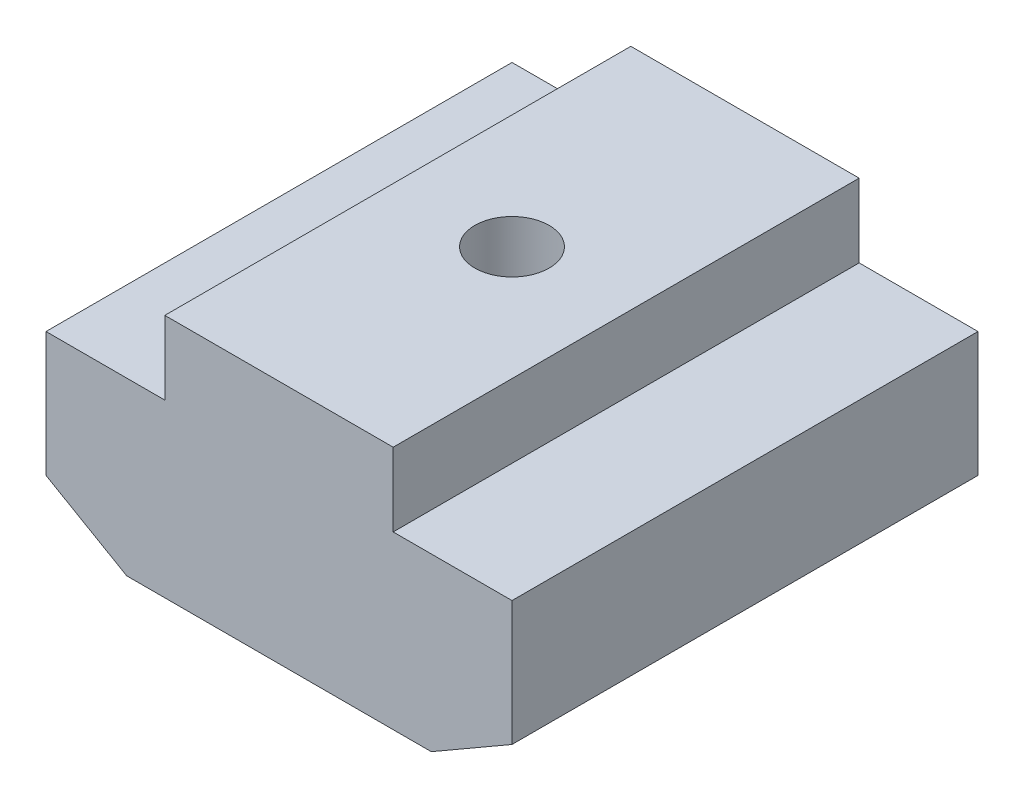
ISO-10303-21;
HEADER;
FILE_DESCRIPTION(('STEP AP214'),'2;1');
FILE_NAME('part.step','',(''),(''),'','','');
FILE_SCHEMA(('AUTOMOTIVE_DESIGN { 1 0 10303 214 1 1 1 1 }'));
ENDSEC;
DATA;
#1=APPLICATION_CONTEXT('core data for automotive mechanical design processes');
#2=APPLICATION_PROTOCOL_DEFINITION('international standard','automotive_design',2000,#1);
#3=PRODUCT_CONTEXT('',#1,'mechanical');
#4=PRODUCT('Part','Part','',(#3));
#5=PRODUCT_RELATED_PRODUCT_CATEGORY('part','',(#4));
#6=PRODUCT_DEFINITION_FORMATION('','',#4);
#7=PRODUCT_DEFINITION_CONTEXT('part definition',#1,'design');
#8=PRODUCT_DEFINITION('design','',#6,#7);
#9=PRODUCT_DEFINITION_SHAPE('','',#8);
#10=(LENGTH_UNIT() NAMED_UNIT(*) SI_UNIT(.MILLI.,.METRE.));
#11=(NAMED_UNIT(*) PLANE_ANGLE_UNIT() SI_UNIT($,.RADIAN.));
#12=(NAMED_UNIT(*) SI_UNIT($,.STERADIAN.) SOLID_ANGLE_UNIT());
#13=UNCERTAINTY_MEASURE_WITH_UNIT(LENGTH_MEASURE(1.E-05),#10,'distance_accuracy_value','');
#14=(GEOMETRIC_REPRESENTATION_CONTEXT(3) GLOBAL_UNCERTAINTY_ASSIGNED_CONTEXT((#13)) GLOBAL_UNIT_ASSIGNED_CONTEXT((#10,
#11,#12)) REPRESENTATION_CONTEXT('',''));
#15=CARTESIAN_POINT('',(0.,0.,0.));
#16=DIRECTION('',(0.,0.,1.));
#17=DIRECTION('',(1.,0.,0.));
#18=AXIS2_PLACEMENT_3D('',#15,#16,#17);
#19=CARTESIAN_POINT('',(-10.,-1.675,0.));
#20=DIRECTION('',(0.50000000000019,0.866025403784329,0.));
#21=DIRECTION('',(0.,0.,-1.));
#22=AXIS2_PLACEMENT_3D('',#19,#20,#21);
#23=PLANE('',#22);
#24=DIRECTION('',(0.,0.,1.));
#25=VECTOR('',#24,1.);
#26=CARTESIAN_POINT('',(-10.,-1.675,0.));
#27=LINE('',#26,#25);
#28=CARTESIAN_POINT('',(-10.,-1.675,-10.));
#29=VERTEX_POINT('',#28);
#30=CARTESIAN_POINT('',(-10.,-1.675,10.));
#31=VERTEX_POINT('',#30);
#32=EDGE_CURVE('E238',#29,#31,#27,.T.);
#33=ORIENTED_EDGE('',*,*,#32,.F.);
#34=DIRECTION('',(0.866025403784329,-0.50000000000019,0.));
#35=VECTOR('',#34,1.);
#36=CARTESIAN_POINT('',(-8.26794919243,-2.675,-10.));
#37=LINE('',#36,#35);
#38=CARTESIAN_POINT('',(-6.53589838486,-3.675,-10.));
#39=VERTEX_POINT('',#38);
#40=EDGE_CURVE('E250',#29,#39,#37,.T.);
#41=ORIENTED_EDGE('',*,*,#40,.T.);
#42=DIRECTION('',(0.,0.,1.));
#43=VECTOR('',#42,1.);
#44=CARTESIAN_POINT('',(-6.53589838486,-3.675,0.));
#45=LINE('',#44,#43);
#46=CARTESIAN_POINT('',(-6.53589838486,-3.675,10.));
#47=VERTEX_POINT('',#46);
#48=EDGE_CURVE('E11',#39,#47,#45,.T.);
#49=ORIENTED_EDGE('',*,*,#48,.T.);
#50=DIRECTION('',(-0.866025403784329,0.50000000000019,0.));
#51=VECTOR('',#50,1.);
#52=CARTESIAN_POINT('',(-8.26794919243,-2.675,10.));
#53=LINE('',#52,#51);
#54=EDGE_CURVE('E20',#47,#31,#53,.T.);
#55=ORIENTED_EDGE('',*,*,#54,.T.);
#56=EDGE_LOOP('',(#33,#41,#49,#55));
#57=FACE_BOUND('',#56,.T.);
#58=ADVANCED_FACE('F17',(#57),#23,.F.);
#59=CARTESIAN_POINT('',(10.,-3.675,0.));
#60=DIRECTION('',(0.,1.,0.));
#61=DIRECTION('',(1.,0.,0.));
#62=AXIS2_PLACEMENT_3D('',#59,#60,#61);
#63=PLANE('',#62);
#64=CARTESIAN_POINT('',(0.,-3.675,0.));
#65=DIRECTION('',(0.,1.,0.));
#66=DIRECTION('',(1.,0.,0.));
#67=AXIS2_PLACEMENT_3D('',#64,#65,#66);
#68=CIRCLE('',#67,2.4585);
#69=CARTESIAN_POINT('',(-2.4585,-3.675,0.));
#70=VERTEX_POINT('',#69);
#71=CARTESIAN_POINT('',(2.4585,-3.675,0.));
#72=VERTEX_POINT('',#71);
#73=EDGE_CURVE('E299',#70,#72,#68,.T.);
#74=ORIENTED_EDGE('',*,*,#73,.T.);
#75=CARTESIAN_POINT('',(0.,-3.675,0.));
#76=DIRECTION('',(0.,1.,0.));
#77=DIRECTION('',(1.,0.,0.));
#78=AXIS2_PLACEMENT_3D('',#75,#76,#77);
#79=CIRCLE('',#78,2.4585);
#80=EDGE_CURVE('E273',#72,#70,#79,.T.);
#81=ORIENTED_EDGE('',*,*,#80,.T.);
#82=EDGE_LOOP('',(#74,#81));
#83=FACE_BOUND('',#82,.T.);
#84=ORIENTED_EDGE('',*,*,#48,.F.);
#85=DIRECTION('',(1.,0.,0.));
#86=VECTOR('',#85,1.);
#87=CARTESIAN_POINT('',(0.,-3.675,-10.));
#88=LINE('',#87,#86);
#89=CARTESIAN_POINT('',(6.53589838486,-3.675,-10.));
#90=VERTEX_POINT('',#89);
#91=EDGE_CURVE('E252',#39,#90,#88,.T.);
#92=ORIENTED_EDGE('',*,*,#91,.T.);
#93=DIRECTION('',(0.,0.,1.));
#94=VECTOR('',#93,1.);
#95=CARTESIAN_POINT('',(6.53589838486,-3.675,0.));
#96=LINE('',#95,#94);
#97=CARTESIAN_POINT('',(6.53589838486,-3.675,10.));
#98=VERTEX_POINT('',#97);
#99=EDGE_CURVE('E155',#90,#98,#96,.T.);
#100=ORIENTED_EDGE('',*,*,#99,.T.);
#101=DIRECTION('',(1.,0.,0.));
#102=VECTOR('',#101,1.);
#103=CARTESIAN_POINT('',(0.,-3.675,10.));
#104=LINE('',#103,#102);
#105=EDGE_CURVE('E254',#47,#98,#104,.T.);
#106=ORIENTED_EDGE('',*,*,#105,.F.);
#107=EDGE_LOOP('',(#84,#92,#100,#106));
#108=FACE_BOUND('',#107,.T.);
#109=ADVANCED_FACE('F332',(#83,#108),#63,.F.);
#110=CARTESIAN_POINT('',(0.,0.,10.));
#111=DIRECTION('',(0.,0.,1.));
#112=DIRECTION('',(1.,0.,0.));
#113=AXIS2_PLACEMENT_3D('',#110,#111,#112);
#114=PLANE('',#113);
#115=ORIENTED_EDGE('',*,*,#105,.T.);
#116=DIRECTION('',(-0.866025403784329,-0.50000000000019,0.));
#117=VECTOR('',#116,1.);
#118=CARTESIAN_POINT('',(8.26794919243,-2.675,10.));
#119=LINE('',#118,#117);
#120=CARTESIAN_POINT('',(10.,-1.675,10.));
#121=VERTEX_POINT('',#120);
#122=EDGE_CURVE('E149',#121,#98,#119,.T.);
#123=ORIENTED_EDGE('',*,*,#122,.F.);
#124=DIRECTION('',(0.,1.,0.));
#125=VECTOR('',#124,1.);
#126=CARTESIAN_POINT('',(10.,1.,10.));
#127=LINE('',#126,#125);
#128=CARTESIAN_POINT('',(10.,3.675,10.));
#129=VERTEX_POINT('',#128);
#130=EDGE_CURVE('E142',#121,#129,#127,.T.);
#131=ORIENTED_EDGE('',*,*,#130,.T.);
#132=DIRECTION('',(-1.,0.,0.));
#133=VECTOR('',#132,1.);
#134=CARTESIAN_POINT('',(7.45,3.675,10.));
#135=LINE('',#134,#133);
#136=CARTESIAN_POINT('',(4.9,3.675,10.));
#137=VERTEX_POINT('',#136);
#138=EDGE_CURVE('E146',#129,#137,#135,.T.);
#139=ORIENTED_EDGE('',*,*,#138,.T.);
#140=DIRECTION('',(0.,1.,0.));
#141=VECTOR('',#140,1.);
#142=CARTESIAN_POINT('',(4.9,5.25,10.));
#143=LINE('',#142,#141);
#144=CARTESIAN_POINT('',(4.9,6.825,10.));
#145=VERTEX_POINT('',#144);
#146=EDGE_CURVE('E221',#137,#145,#143,.T.);
#147=ORIENTED_EDGE('',*,*,#146,.T.);
#148=DIRECTION('',(-1.,0.,0.));
#149=VECTOR('',#148,1.);
#150=CARTESIAN_POINT('',(0.,6.825,10.));
#151=LINE('',#150,#149);
#152=CARTESIAN_POINT('',(-4.9,6.825,10.));
#153=VERTEX_POINT('',#152);
#154=EDGE_CURVE('E206',#145,#153,#151,.T.);
#155=ORIENTED_EDGE('',*,*,#154,.T.);
#156=DIRECTION('',(0.,-1.,0.));
#157=VECTOR('',#156,1.);
#158=CARTESIAN_POINT('',(-4.9,5.25,10.));
#159=LINE('',#158,#157);
#160=CARTESIAN_POINT('',(-4.9,3.675,10.));
#161=VERTEX_POINT('',#160);
#162=EDGE_CURVE('E205',#153,#161,#159,.T.);
#163=ORIENTED_EDGE('',*,*,#162,.T.);
#164=DIRECTION('',(-1.,0.,0.));
#165=VECTOR('',#164,1.);
#166=CARTESIAN_POINT('',(-7.45,3.675,10.));
#167=LINE('',#166,#165);
#168=CARTESIAN_POINT('',(-10.,3.675,10.));
#169=VERTEX_POINT('',#168);
#170=EDGE_CURVE('E194',#161,#169,#167,.T.);
#171=ORIENTED_EDGE('',*,*,#170,.T.);
#172=DIRECTION('',(0.,-1.,0.));
#173=VECTOR('',#172,1.);
#174=CARTESIAN_POINT('',(-10.,1.,10.));
#175=LINE('',#174,#173);
#176=EDGE_CURVE('E242',#169,#31,#175,.T.);
#177=ORIENTED_EDGE('',*,*,#176,.T.);
#178=ORIENTED_EDGE('',*,*,#54,.F.);
#179=EDGE_LOOP('',(#115,#123,#131,#139,#147,#155,#163,#171,#177,#178));
#180=FACE_BOUND('',#179,.T.);
#181=ADVANCED_FACE('F144',(#180),#114,.T.);
#182=CARTESIAN_POINT('',(0.,0.,-10.));
#183=DIRECTION('',(0.,0.,1.));
#184=DIRECTION('',(1.,0.,0.));
#185=AXIS2_PLACEMENT_3D('',#182,#183,#184);
#186=PLANE('',#185);
#187=ORIENTED_EDGE('',*,*,#40,.F.);
#188=DIRECTION('',(0.,-1.,0.));
#189=VECTOR('',#188,1.);
#190=CARTESIAN_POINT('',(-10.,1.,-10.));
#191=LINE('',#190,#189);
#192=CARTESIAN_POINT('',(-10.,3.675,-10.));
#193=VERTEX_POINT('',#192);
#194=EDGE_CURVE('E246',#193,#29,#191,.T.);
#195=ORIENTED_EDGE('',*,*,#194,.F.);
#196=DIRECTION('',(-1.,0.,0.));
#197=VECTOR('',#196,1.);
#198=CARTESIAN_POINT('',(-7.45,3.675,-10.));
#199=LINE('',#198,#197);
#200=CARTESIAN_POINT('',(-4.9,3.675,-10.));
#201=VERTEX_POINT('',#200);
#202=EDGE_CURVE('E186',#201,#193,#199,.T.);
#203=ORIENTED_EDGE('',*,*,#202,.F.);
#204=DIRECTION('',(0.,-1.,0.));
#205=VECTOR('',#204,1.);
#206=CARTESIAN_POINT('',(-4.9,5.25,-10.));
#207=LINE('',#206,#205);
#208=CARTESIAN_POINT('',(-4.9,6.825,-10.));
#209=VERTEX_POINT('',#208);
#210=EDGE_CURVE('E202',#209,#201,#207,.T.);
#211=ORIENTED_EDGE('',*,*,#210,.F.);
#212=DIRECTION('',(-1.,0.,0.));
#213=VECTOR('',#212,1.);
#214=CARTESIAN_POINT('',(0.,6.825,-10.));
#215=LINE('',#214,#213);
#216=CARTESIAN_POINT('',(4.9,6.825,-10.));
#217=VERTEX_POINT('',#216);
#218=EDGE_CURVE('E210',#217,#209,#215,.T.);
#219=ORIENTED_EDGE('',*,*,#218,.F.);
#220=DIRECTION('',(0.,1.,0.));
#221=VECTOR('',#220,1.);
#222=CARTESIAN_POINT('',(4.9,5.25,-10.));
#223=LINE('',#222,#221);
#224=CARTESIAN_POINT('',(4.9,3.675,-10.));
#225=VERTEX_POINT('',#224);
#226=EDGE_CURVE('E213',#225,#217,#223,.T.);
#227=ORIENTED_EDGE('',*,*,#226,.F.);
#228=DIRECTION('',(-1.,0.,0.));
#229=VECTOR('',#228,1.);
#230=CARTESIAN_POINT('',(7.45,3.675,-10.));
#231=LINE('',#230,#229);
#232=CARTESIAN_POINT('',(10.,3.675,-10.));
#233=VERTEX_POINT('',#232);
#234=EDGE_CURVE('E172',#233,#225,#231,.T.);
#235=ORIENTED_EDGE('',*,*,#234,.F.);
#236=DIRECTION('',(0.,1.,0.));
#237=VECTOR('',#236,1.);
#238=CARTESIAN_POINT('',(10.,1.,-10.));
#239=LINE('',#238,#237);
#240=CARTESIAN_POINT('',(10.,-1.675,-10.));
#241=VERTEX_POINT('',#240);
#242=EDGE_CURVE('E156',#241,#233,#239,.T.);
#243=ORIENTED_EDGE('',*,*,#242,.F.);
#244=DIRECTION('',(0.866025403784329,0.50000000000019,0.));
#245=VECTOR('',#244,1.);
#246=CARTESIAN_POINT('',(8.26794919243,-2.675,-10.));
#247=LINE('',#246,#245);
#248=EDGE_CURVE('E233',#90,#241,#247,.T.);
#249=ORIENTED_EDGE('',*,*,#248,.F.);
#250=ORIENTED_EDGE('',*,*,#91,.F.);
#251=EDGE_LOOP('',(#187,#195,#203,#211,#219,#227,#235,#243,#249,#250));
#252=FACE_BOUND('',#251,.T.);
#253=ADVANCED_FACE('F343',(#252),#186,.F.);
#254=CARTESIAN_POINT('',(-10.,-3.675,0.));
#255=DIRECTION('',(1.,0.,0.));
#256=DIRECTION('',(0.,1.,0.));
#257=AXIS2_PLACEMENT_3D('',#254,#255,#256);
#258=PLANE('',#257);
#259=ORIENTED_EDGE('',*,*,#32,.T.);
#260=ORIENTED_EDGE('',*,*,#176,.F.);
#261=DIRECTION('',(0.,0.,1.));
#262=VECTOR('',#261,1.);
#263=CARTESIAN_POINT('',(-10.,3.675,0.));
#264=LINE('',#263,#262);
#265=EDGE_CURVE('E190',#193,#169,#264,.T.);
#266=ORIENTED_EDGE('',*,*,#265,.F.);
#267=ORIENTED_EDGE('',*,*,#194,.T.);
#268=EDGE_LOOP('',(#259,#260,#266,#267));
#269=FACE_BOUND('',#268,.T.);
#270=ADVANCED_FACE('F339',(#269),#258,.F.);
#271=CARTESIAN_POINT('',(10.,-1.675,0.));
#272=DIRECTION('',(-0.50000000000019,0.866025403784329,0.));
#273=DIRECTION('',(0.,0.,1.));
#274=AXIS2_PLACEMENT_3D('',#271,#272,#273);
#275=PLANE('',#274);
#276=ORIENTED_EDGE('',*,*,#99,.F.);
#277=ORIENTED_EDGE('',*,*,#248,.T.);
#278=DIRECTION('',(0.,0.,1.));
#279=VECTOR('',#278,1.);
#280=CARTESIAN_POINT('',(10.,-1.675,0.));
#281=LINE('',#280,#279);
#282=EDGE_CURVE('E209',#241,#121,#281,.T.);
#283=ORIENTED_EDGE('',*,*,#282,.T.);
#284=ORIENTED_EDGE('',*,*,#122,.T.);
#285=EDGE_LOOP('',(#276,#277,#283,#284));
#286=FACE_BOUND('',#285,.T.);
#287=ADVANCED_FACE('F348',(#286),#275,.F.);
#288=CARTESIAN_POINT('',(10.,3.675,0.));
#289=DIRECTION('',(-1.,0.,0.));
#290=DIRECTION('',(0.,0.,1.));
#291=AXIS2_PLACEMENT_3D('',#288,#289,#290);
#292=PLANE('',#291);
#293=ORIENTED_EDGE('',*,*,#282,.F.);
#294=ORIENTED_EDGE('',*,*,#242,.T.);
#295=DIRECTION('',(0.,0.,1.));
#296=VECTOR('',#295,1.);
#297=CARTESIAN_POINT('',(10.,3.675,0.));
#298=LINE('',#297,#296);
#299=EDGE_CURVE('E162',#233,#129,#298,.T.);
#300=ORIENTED_EDGE('',*,*,#299,.T.);
#301=ORIENTED_EDGE('',*,*,#130,.F.);
#302=EDGE_LOOP('',(#293,#294,#300,#301));
#303=FACE_BOUND('',#302,.T.);
#304=ADVANCED_FACE('F168',(#303),#292,.F.);
#305=CARTESIAN_POINT('',(-4.9,6.825,0.));
#306=DIRECTION('',(0.,-1.,0.));
#307=DIRECTION('',(0.,0.,-1.));
#308=AXIS2_PLACEMENT_3D('',#305,#306,#307);
#309=PLANE('',#308);
#310=CARTESIAN_POINT('',(0.,6.825,0.));
#311=DIRECTION('',(0.,-1.,0.));
#312=DIRECTION('',(1.,0.,0.));
#313=AXIS2_PLACEMENT_3D('',#310,#311,#312);
#314=CIRCLE('',#313,1.59247459622);
#315=CARTESIAN_POINT('',(1.59247459622,6.825,0.));
#316=VERTEX_POINT('',#315);
#317=CARTESIAN_POINT('',(-1.59247459622,6.825,0.));
#318=VERTEX_POINT('',#317);
#319=EDGE_CURVE('E277',#316,#318,#314,.T.);
#320=ORIENTED_EDGE('',*,*,#319,.T.);
#321=CARTESIAN_POINT('',(0.,6.825,0.));
#322=DIRECTION('',(0.,-1.,0.));
#323=DIRECTION('',(1.,0.,0.));
#324=AXIS2_PLACEMENT_3D('',#321,#322,#323);
#325=CIRCLE('',#324,1.59247459622);
#326=EDGE_CURVE('E173',#318,#316,#325,.T.);
#327=ORIENTED_EDGE('',*,*,#326,.T.);
#328=EDGE_LOOP('',(#320,#327));
#329=FACE_BOUND('',#328,.T.);
#330=DIRECTION('',(0.,0.,1.));
#331=VECTOR('',#330,1.);
#332=CARTESIAN_POINT('',(4.9,6.825,0.));
#333=LINE('',#332,#331);
#334=EDGE_CURVE('E217',#217,#145,#333,.T.);
#335=ORIENTED_EDGE('',*,*,#334,.F.);
#336=ORIENTED_EDGE('',*,*,#218,.T.);
#337=DIRECTION('',(0.,0.,1.));
#338=VECTOR('',#337,1.);
#339=CARTESIAN_POINT('',(-4.9,6.825,0.));
#340=LINE('',#339,#338);
#341=EDGE_CURVE('E198',#209,#153,#340,.T.);
#342=ORIENTED_EDGE('',*,*,#341,.T.);
#343=ORIENTED_EDGE('',*,*,#154,.F.);
#344=EDGE_LOOP('',(#335,#336,#342,#343));
#345=FACE_BOUND('',#344,.T.);
#346=ADVANCED_FACE('F316',(#329,#345),#309,.F.);
#347=CARTESIAN_POINT('',(4.9,6.825,0.));
#348=DIRECTION('',(-1.,0.,0.));
#349=DIRECTION('',(0.,0.,1.));
#350=AXIS2_PLACEMENT_3D('',#347,#348,#349);
#351=PLANE('',#350);
#352=DIRECTION('',(0.,0.,1.));
#353=VECTOR('',#352,1.);
#354=CARTESIAN_POINT('',(4.9,3.675,0.));
#355=LINE('',#354,#353);
#356=EDGE_CURVE('E164',#225,#137,#355,.T.);
#357=ORIENTED_EDGE('',*,*,#356,.F.);
#358=ORIENTED_EDGE('',*,*,#226,.T.);
#359=ORIENTED_EDGE('',*,*,#334,.T.);
#360=ORIENTED_EDGE('',*,*,#146,.F.);
#361=EDGE_LOOP('',(#357,#358,#359,#360));
#362=FACE_BOUND('',#361,.T.);
#363=ADVANCED_FACE('F359',(#362),#351,.F.);
#364=CARTESIAN_POINT('',(-4.9,3.675,0.));
#365=DIRECTION('',(1.,0.,0.));
#366=DIRECTION('',(0.,1.,0.));
#367=AXIS2_PLACEMENT_3D('',#364,#365,#366);
#368=PLANE('',#367);
#369=ORIENTED_EDGE('',*,*,#341,.F.);
#370=ORIENTED_EDGE('',*,*,#210,.T.);
#371=DIRECTION('',(0.,0.,1.));
#372=VECTOR('',#371,1.);
#373=CARTESIAN_POINT('',(-4.9,3.675,0.));
#374=LINE('',#373,#372);
#375=EDGE_CURVE('E166',#201,#161,#374,.T.);
#376=ORIENTED_EDGE('',*,*,#375,.T.);
#377=ORIENTED_EDGE('',*,*,#162,.F.);
#378=EDGE_LOOP('',(#369,#370,#376,#377));
#379=FACE_BOUND('',#378,.T.);
#380=ADVANCED_FACE('F373',(#379),#368,.F.);
#381=CARTESIAN_POINT('',(4.9,3.675,0.));
#382=DIRECTION('',(0.,-1.,0.));
#383=DIRECTION('',(0.,0.,-1.));
#384=AXIS2_PLACEMENT_3D('',#381,#382,#383);
#385=PLANE('',#384);
#386=ORIENTED_EDGE('',*,*,#375,.F.);
#387=ORIENTED_EDGE('',*,*,#202,.T.);
#388=ORIENTED_EDGE('',*,*,#265,.T.);
#389=ORIENTED_EDGE('',*,*,#170,.F.);
#390=EDGE_LOOP('',(#386,#387,#388,#389));
#391=FACE_BOUND('',#390,.T.);
#392=ADVANCED_FACE('F328',(#391),#385,.F.);
#393=CARTESIAN_POINT('',(4.9,3.675,0.));
#394=DIRECTION('',(0.,-1.,0.));
#395=DIRECTION('',(0.,0.,-1.));
#396=AXIS2_PLACEMENT_3D('',#393,#394,#395);
#397=PLANE('',#396);
#398=ORIENTED_EDGE('',*,*,#299,.F.);
#399=ORIENTED_EDGE('',*,*,#234,.T.);
#400=ORIENTED_EDGE('',*,*,#356,.T.);
#401=ORIENTED_EDGE('',*,*,#138,.F.);
#402=EDGE_LOOP('',(#398,#399,#400,#401));
#403=FACE_BOUND('',#402,.T.);
#404=ADVANCED_FACE('F160',(#403),#397,.F.);
#405=CARTESIAN_POINT('',(0.,6.7444156368,0.));
#406=DIRECTION('',(0.,-1.,0.));
#407=DIRECTION('',(1.,0.,0.));
#408=AXIS2_PLACEMENT_3D('',#405,#406,#407);
#409=CONICAL_SURFACE('',#408,1.73205080758248,1.0471975512);
#410=ORIENTED_EDGE('',*,*,#326,.F.);
#411=DIRECTION('',(-0.866025403784329,-0.50000000000019,0.));
#412=VECTOR('',#411,1.);
#413=CARTESIAN_POINT('',(-1.22925,7.0347078184,0.));
#414=LINE('',#413,#412);
#415=CARTESIAN_POINT('',(-2.4585,6.325,0.));
#416=VERTEX_POINT('',#415);
#417=EDGE_CURVE('E180',#318,#416,#414,.T.);
#418=ORIENTED_EDGE('',*,*,#417,.T.);
#419=CARTESIAN_POINT('',(0.,6.325,0.));
#420=DIRECTION('',(0.,1.,0.));
#421=DIRECTION('',(1.,0.,0.));
#422=AXIS2_PLACEMENT_3D('',#419,#420,#421);
#423=CIRCLE('',#422,2.4585);
#424=CARTESIAN_POINT('',(2.4585,6.325,0.));
#425=VERTEX_POINT('',#424);
#426=EDGE_CURVE('E282',#425,#416,#423,.T.);
#427=ORIENTED_EDGE('',*,*,#426,.F.);
#428=DIRECTION('',(0.866025403784329,-0.50000000000019,0.));
#429=VECTOR('',#428,1.);
#430=CARTESIAN_POINT('',(1.22925,7.0347078184,0.));
#431=LINE('',#430,#429);
#432=EDGE_CURVE('E281',#316,#425,#431,.T.);
#433=ORIENTED_EDGE('',*,*,#432,.F.);
#434=EDGE_LOOP('',(#410,#418,#427,#433));
#435=FACE_BOUND('',#434,.T.);
#436=ADVANCED_FACE('F318',(#435),#409,.F.);
#437=CARTESIAN_POINT('',(0.,6.7444156368,0.));
#438=DIRECTION('',(0.,-1.,0.));
#439=DIRECTION('',(1.,0.,0.));
#440=AXIS2_PLACEMENT_3D('',#437,#438,#439);
#441=CONICAL_SURFACE('',#440,1.73205080758248,1.0471975512);
#442=ORIENTED_EDGE('',*,*,#319,.F.);
#443=ORIENTED_EDGE('',*,*,#432,.T.);
#444=CARTESIAN_POINT('',(0.,6.325,0.));
#445=DIRECTION('',(0.,1.,0.));
#446=DIRECTION('',(1.,0.,0.));
#447=AXIS2_PLACEMENT_3D('',#444,#445,#446);
#448=CIRCLE('',#447,2.4585);
#449=EDGE_CURVE('E265',#416,#425,#448,.T.);
#450=ORIENTED_EDGE('',*,*,#449,.F.);
#451=ORIENTED_EDGE('',*,*,#417,.F.);
#452=EDGE_LOOP('',(#442,#443,#450,#451));
#453=FACE_BOUND('',#452,.T.);
#454=ADVANCED_FACE('F314',(#453),#441,.F.);
#455=CARTESIAN_POINT('',(0.,-3.675,0.));
#456=DIRECTION('',(0.,1.,0.));
#457=DIRECTION('',(1.,0.,0.));
#458=AXIS2_PLACEMENT_3D('',#455,#456,#457);
#459=CYLINDRICAL_SURFACE('',#458,2.4585);
#460=ORIENTED_EDGE('',*,*,#80,.F.);
#461=DIRECTION('',(0.,-1.,0.));
#462=VECTOR('',#461,1.);
#463=CARTESIAN_POINT('',(2.4585,1.16999999996,0.));
#464=LINE('',#463,#462);
#465=EDGE_CURVE('E268',#425,#72,#464,.T.);
#466=ORIENTED_EDGE('',*,*,#465,.F.);
#467=ORIENTED_EDGE('',*,*,#426,.T.);
#468=DIRECTION('',(0.,-1.,0.));
#469=VECTOR('',#468,1.);
#470=CARTESIAN_POINT('',(-2.4585,1.16999999996,0.));
#471=LINE('',#470,#469);
#472=EDGE_CURVE('E263',#416,#70,#471,.T.);
#473=ORIENTED_EDGE('',*,*,#472,.T.);
#474=EDGE_LOOP('',(#460,#466,#467,#473));
#475=FACE_BOUND('',#474,.T.);
#476=ADVANCED_FACE('F310',(#475),#459,.F.);
#477=CARTESIAN_POINT('',(0.,-3.675,0.));
#478=DIRECTION('',(0.,1.,0.));
#479=DIRECTION('',(1.,0.,0.));
#480=AXIS2_PLACEMENT_3D('',#477,#478,#479);
#481=CYLINDRICAL_SURFACE('',#480,2.4585);
#482=ORIENTED_EDGE('',*,*,#73,.F.);
#483=ORIENTED_EDGE('',*,*,#472,.F.);
#484=ORIENTED_EDGE('',*,*,#449,.T.);
#485=ORIENTED_EDGE('',*,*,#465,.T.);
#486=EDGE_LOOP('',(#482,#483,#484,#485));
#487=FACE_BOUND('',#486,.T.);
#488=ADVANCED_FACE('F313',(#487),#481,.F.);
#489=CLOSED_SHELL('',(#58,#109,#181,#253,#270,#287,#304,#346,#363,#380,#392,#404,#436,#454,#476,#488));
#490=MANIFOLD_SOLID_BREP('B1',#489);
#491=ADVANCED_BREP_SHAPE_REPRESENTATION('',(#18,#490),#14);
#492=SHAPE_DEFINITION_REPRESENTATION(#9,#491);
ENDSEC;
END-ISO-10303-21;
